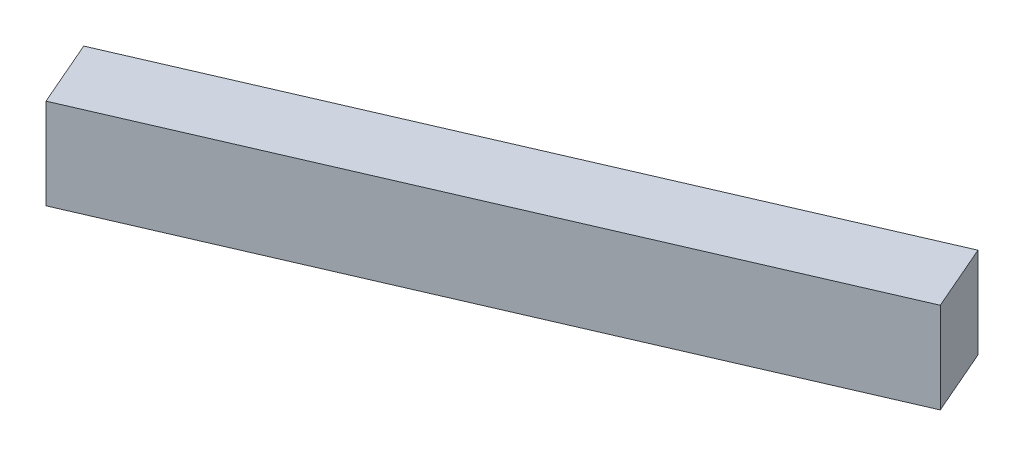
ISO-10303-21;
HEADER;
FILE_DESCRIPTION(('STEP AP214'),'2;1');
FILE_NAME('part.step','',(''),(''),'','','');
FILE_SCHEMA(('AUTOMOTIVE_DESIGN { 1 0 10303 214 1 1 1 1 }'));
ENDSEC;
DATA;
#1=APPLICATION_CONTEXT('core data for automotive mechanical design processes');
#2=APPLICATION_PROTOCOL_DEFINITION('international standard','automotive_design',2000,#1);
#3=PRODUCT_CONTEXT('',#1,'mechanical');
#4=PRODUCT('Part','Part','',(#3));
#5=PRODUCT_RELATED_PRODUCT_CATEGORY('part','',(#4));
#6=PRODUCT_DEFINITION_FORMATION('','',#4);
#7=PRODUCT_DEFINITION_CONTEXT('part definition',#1,'design');
#8=PRODUCT_DEFINITION('design','',#6,#7);
#9=PRODUCT_DEFINITION_SHAPE('','',#8);
#10=(LENGTH_UNIT() NAMED_UNIT(*) SI_UNIT(.MILLI.,.METRE.));
#11=(NAMED_UNIT(*) PLANE_ANGLE_UNIT() SI_UNIT($,.RADIAN.));
#12=(NAMED_UNIT(*) SI_UNIT($,.STERADIAN.) SOLID_ANGLE_UNIT());
#13=UNCERTAINTY_MEASURE_WITH_UNIT(LENGTH_MEASURE(1.E-05),#10,'distance_accuracy_value','');
#14=(GEOMETRIC_REPRESENTATION_CONTEXT(3) GLOBAL_UNCERTAINTY_ASSIGNED_CONTEXT((#13)) GLOBAL_UNIT_ASSIGNED_CONTEXT((#10,
#11,#12)) REPRESENTATION_CONTEXT('',''));
#15=CARTESIAN_POINT('',(0.,0.,0.));
#16=DIRECTION('',(0.,0.,1.));
#17=DIRECTION('',(1.,0.,0.));
#18=AXIS2_PLACEMENT_3D('',#15,#16,#17);
#19=CARTESIAN_POINT('',(16.474412251126,7.874,-7.24789644773476));
#20=DIRECTION('',(0.397596342713969,0.,0.91756043302906));
#21=DIRECTION('',(0.91756043302906,0.,-0.397596342713969));
#22=AXIS2_PLACEMENT_3D('',#19,#20,#21);
#23=PLANE('',#22);
#24=DIRECTION('',(0.,1.,0.));
#25=VECTOR('',#24,1.);
#26=CARTESIAN_POINT('',(16.474412251126,7.874,-7.24789644773476));
#27=LINE('',#26,#25);
#28=CARTESIAN_POINT('',(16.474412251126,7.62,-7.24789644773476));
#29=VERTEX_POINT('',#28);
#30=CARTESIAN_POINT('',(16.474412251126,7.874,-7.24789644773476));
#31=VERTEX_POINT('',#30);
#32=EDGE_CURVE('E20',#29,#31,#27,.T.);
#33=ORIENTED_EDGE('',*,*,#32,.T.);
#34=DIRECTION('',(-0.917560433029055,0.,0.397596342713981));
#35=VECTOR('',#34,1.);
#36=CARTESIAN_POINT('',(18.2223648760463,7.874,-8.00531748060487));
#37=LINE('',#36,#35);
#38=CARTESIAN_POINT('',(18.2223648760463,7.874,-8.00531748060486));
#39=VERTEX_POINT('',#38);
#40=EDGE_CURVE('E55',#39,#31,#37,.T.);
#41=ORIENTED_EDGE('',*,*,#40,.F.);
#42=DIRECTION('',(0.,1.,0.));
#43=VECTOR('',#42,1.);
#44=CARTESIAN_POINT('',(18.2223648760463,7.874,-8.00531748060487));
#45=LINE('',#44,#43);
#46=CARTESIAN_POINT('',(18.2223648760463,7.62,-8.00531748060486));
#47=VERTEX_POINT('',#46);
#48=EDGE_CURVE('E76',#39,#47,#45,.F.);
#49=ORIENTED_EDGE('',*,*,#48,.T.);
#50=DIRECTION('',(-0.917560433029055,0.,0.397596342713981));
#51=VECTOR('',#50,1.);
#52=CARTESIAN_POINT('',(18.2223648760463,7.62,-8.00531748060487));
#53=LINE('',#52,#51);
#54=EDGE_CURVE('E58',#47,#29,#53,.T.);
#55=ORIENTED_EDGE('',*,*,#54,.T.);
#56=EDGE_LOOP('',(#33,#41,#49,#55));
#57=FACE_BOUND('',#56,.T.);
#58=ADVANCED_FACE('F17',(#57),#23,.F.);
#59=CARTESIAN_POINT('',(16.474412251126,7.874,-7.24789644773476));
#60=DIRECTION('',(0.917560433029057,0.,-0.397596342713976));
#61=DIRECTION('',(-0.397596342713976,0.,-0.917560433029057));
#62=AXIS2_PLACEMENT_3D('',#59,#60,#61);
#63=PLANE('',#62);
#64=DIRECTION('',(0.,1.,0.));
#65=VECTOR('',#64,1.);
#66=CARTESIAN_POINT('',(16.5552038279654,7.874,-7.06144816774325));
#67=LINE('',#66,#65);
#68=CARTESIAN_POINT('',(16.5552038279654,7.62,-7.06144816774327));
#69=VERTEX_POINT('',#68);
#70=CARTESIAN_POINT('',(16.5552038279654,7.874,-7.06144816774327));
#71=VERTEX_POINT('',#70);
#72=EDGE_CURVE('E73',#69,#71,#67,.T.);
#73=ORIENTED_EDGE('',*,*,#72,.T.);
#74=DIRECTION('',(0.397596342713618,0.,0.917560433029212));
#75=VECTOR('',#74,1.);
#76=CARTESIAN_POINT('',(16.474412251126,7.874,-7.24789644773476));
#77=LINE('',#76,#75);
#78=EDGE_CURVE('E63',#31,#71,#77,.T.);
#79=ORIENTED_EDGE('',*,*,#78,.F.);
#80=ORIENTED_EDGE('',*,*,#32,.F.);
#81=DIRECTION('',(0.397596342713618,0.,0.917560433029212));
#82=VECTOR('',#81,1.);
#83=CARTESIAN_POINT('',(16.474412251126,7.62,-7.24789644773476));
#84=LINE('',#83,#82);
#85=EDGE_CURVE('E80',#29,#69,#84,.T.);
#86=ORIENTED_EDGE('',*,*,#85,.T.);
#87=EDGE_LOOP('',(#73,#79,#80,#86));
#88=FACE_BOUND('',#87,.T.);
#89=ADVANCED_FACE('F72',(#88),#63,.F.);
#90=CARTESIAN_POINT('',(16.5552038279654,7.874,-7.06144816774325));
#91=DIRECTION('',(0.,1.,0.));
#92=DIRECTION('',(0.,0.,1.));
#93=AXIS2_PLACEMENT_3D('',#90,#91,#92);
#94=PLANE('',#93);
#95=DIRECTION('',(0.397596344110778,0.,0.917560432423796));
#96=VECTOR('',#95,1.);
#97=CARTESIAN_POINT('',(18.2223648760463,7.874,-8.00531748060487));
#98=LINE('',#97,#96);
#99=CARTESIAN_POINT('',(18.3031564531696,7.874,-7.81886920073636));
#100=VERTEX_POINT('',#99);
#101=EDGE_CURVE('E69',#100,#39,#98,.F.);
#102=ORIENTED_EDGE('',*,*,#101,.T.);
#103=ORIENTED_EDGE('',*,*,#40,.T.);
#104=ORIENTED_EDGE('',*,*,#78,.T.);
#105=DIRECTION('',(-0.917560433029059,0.,0.397596342713971));
#106=VECTOR('',#105,1.);
#107=CARTESIAN_POINT('',(16.5552038279654,7.874,-7.06144816774325));
#108=LINE('',#107,#106);
#109=EDGE_CURVE('E83',#71,#100,#108,.F.);
#110=ORIENTED_EDGE('',*,*,#109,.T.);
#111=EDGE_LOOP('',(#102,#103,#104,#110));
#112=FACE_BOUND('',#111,.T.);
#113=ADVANCED_FACE('F66',(#112),#94,.T.);
#114=CARTESIAN_POINT('',(18.2223648760463,7.874,-8.00531748060487));
#115=DIRECTION('',(-0.917560432423796,0.,0.397596344110778));
#116=DIRECTION('',(0.397596344110778,0.,0.917560432423796));
#117=AXIS2_PLACEMENT_3D('',#114,#115,#116);
#118=PLANE('',#117);
#119=ORIENTED_EDGE('',*,*,#48,.F.);
#120=ORIENTED_EDGE('',*,*,#101,.F.);
#121=DIRECTION('',(0.,1.,0.));
#122=VECTOR('',#121,1.);
#123=CARTESIAN_POINT('',(18.3031564531696,7.874,-7.81886920073636));
#124=LINE('',#123,#122);
#125=CARTESIAN_POINT('',(18.3031564531696,7.62,-7.81886920073636));
#126=VERTEX_POINT('',#125);
#127=EDGE_CURVE('E26',#100,#126,#124,.F.);
#128=ORIENTED_EDGE('',*,*,#127,.T.);
#129=DIRECTION('',(-0.397596344110751,0.,-0.917560432423808));
#130=VECTOR('',#129,1.);
#131=CARTESIAN_POINT('',(18.3031564531696,7.62,-7.81886920073636));
#132=LINE('',#131,#130);
#133=EDGE_CURVE('E34',#126,#47,#132,.T.);
#134=ORIENTED_EDGE('',*,*,#133,.T.);
#135=EDGE_LOOP('',(#119,#120,#128,#134));
#136=FACE_BOUND('',#135,.T.);
#137=ADVANCED_FACE('F88',(#136),#118,.F.);
#138=CARTESIAN_POINT('',(16.5552038279654,7.62,-7.06144816774325));
#139=DIRECTION('',(0.,1.,0.));
#140=DIRECTION('',(0.,0.,1.));
#141=AXIS2_PLACEMENT_3D('',#138,#139,#140);
#142=PLANE('',#141);
#143=ORIENTED_EDGE('',*,*,#54,.F.);
#144=ORIENTED_EDGE('',*,*,#133,.F.);
#145=DIRECTION('',(-0.917560433029059,0.,0.397596342713971));
#146=VECTOR('',#145,1.);
#147=CARTESIAN_POINT('',(16.5552038279654,7.62,-7.06144816774325));
#148=LINE('',#147,#146);
#149=EDGE_CURVE('E11',#126,#69,#148,.T.);
#150=ORIENTED_EDGE('',*,*,#149,.T.);
#151=ORIENTED_EDGE('',*,*,#85,.F.);
#152=EDGE_LOOP('',(#143,#144,#150,#151));
#153=FACE_BOUND('',#152,.T.);
#154=ADVANCED_FACE('F91',(#153),#142,.F.);
#155=CARTESIAN_POINT('',(16.5552038279654,7.874,-7.06144816774325));
#156=DIRECTION('',(-0.397596342713971,0.,-0.917560433029059));
#157=DIRECTION('',(-0.917560433029059,0.,0.397596342713971));
#158=AXIS2_PLACEMENT_3D('',#155,#156,#157);
#159=PLANE('',#158);
#160=ORIENTED_EDGE('',*,*,#127,.F.);
#161=ORIENTED_EDGE('',*,*,#109,.F.);
#162=ORIENTED_EDGE('',*,*,#72,.F.);
#163=ORIENTED_EDGE('',*,*,#149,.F.);
#164=EDGE_LOOP('',(#160,#161,#162,#163));
#165=FACE_BOUND('',#164,.T.);
#166=ADVANCED_FACE('F90',(#165),#159,.F.);
#167=CLOSED_SHELL('',(#58,#89,#113,#137,#154,#166));
#168=MANIFOLD_SOLID_BREP('B1',#167);
#169=ADVANCED_BREP_SHAPE_REPRESENTATION('',(#18,#168),#14);
#170=SHAPE_DEFINITION_REPRESENTATION(#9,#169);
ENDSEC;
END-ISO-10303-21;
